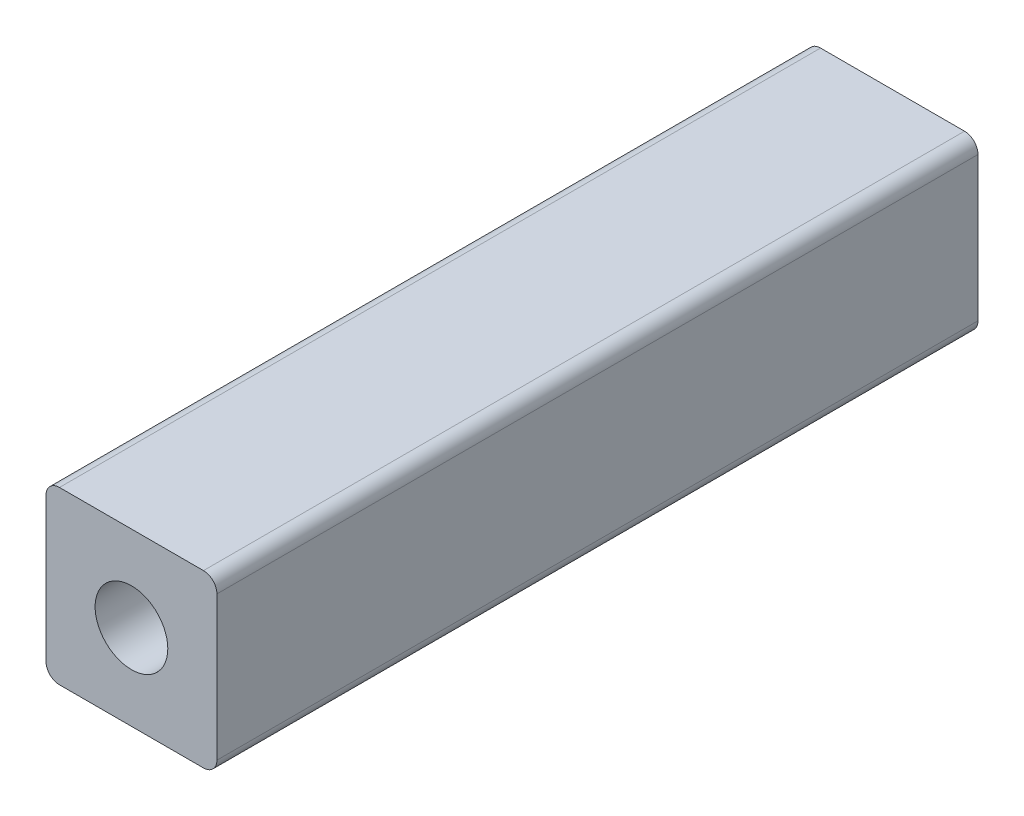
ISO-10303-21;
HEADER;
FILE_DESCRIPTION(('STEP AP214'),'2;1');
FILE_NAME('part.step','',(''),(''),'','','');
FILE_SCHEMA(('AUTOMOTIVE_DESIGN { 1 0 10303 214 1 1 1 1 }'));
ENDSEC;
DATA;
#1=APPLICATION_CONTEXT('core data for automotive mechanical design processes');
#2=APPLICATION_PROTOCOL_DEFINITION('international standard','automotive_design',2000,#1);
#3=PRODUCT_CONTEXT('',#1,'mechanical');
#4=PRODUCT('Part','Part','',(#3));
#5=PRODUCT_RELATED_PRODUCT_CATEGORY('part','',(#4));
#6=PRODUCT_DEFINITION_FORMATION('','',#4);
#7=PRODUCT_DEFINITION_CONTEXT('part definition',#1,'design');
#8=PRODUCT_DEFINITION('design','',#6,#7);
#9=PRODUCT_DEFINITION_SHAPE('','',#8);
#10=(LENGTH_UNIT() NAMED_UNIT(*) SI_UNIT(.MILLI.,.METRE.));
#11=(NAMED_UNIT(*) PLANE_ANGLE_UNIT() SI_UNIT($,.RADIAN.));
#12=(NAMED_UNIT(*) SI_UNIT($,.STERADIAN.) SOLID_ANGLE_UNIT());
#13=UNCERTAINTY_MEASURE_WITH_UNIT(LENGTH_MEASURE(1.E-05),#10,'distance_accuracy_value','');
#14=(GEOMETRIC_REPRESENTATION_CONTEXT(3) GLOBAL_UNCERTAINTY_ASSIGNED_CONTEXT((#13)) GLOBAL_UNIT_ASSIGNED_CONTEXT((#10,
#11,#12)) REPRESENTATION_CONTEXT('',''));
#15=CARTESIAN_POINT('',(0.,0.,0.));
#16=DIRECTION('',(0.,0.,1.));
#17=DIRECTION('',(1.,0.,0.));
#18=AXIS2_PLACEMENT_3D('',#15,#16,#17);
#19=CARTESIAN_POINT('',(0.,0.,28.275));
#20=DIRECTION('',(0.,0.,1.));
#21=DIRECTION('',(1.,0.,0.));
#22=AXIS2_PLACEMENT_3D('',#19,#20,#21);
#23=PLANE('',#22);
#24=DIRECTION('',(0.,-1.,0.));
#25=VECTOR('',#24,1.);
#26=CARTESIAN_POINT('',(-6.35,6.35,28.275));
#27=LINE('',#26,#25);
#28=CARTESIAN_POINT('',(-6.35,5.35,28.275));
#29=VERTEX_POINT('',#28);
#30=CARTESIAN_POINT('',(-6.35,-5.35,28.275));
#31=VERTEX_POINT('',#30);
#32=EDGE_CURVE('E181',#29,#31,#27,.T.);
#33=ORIENTED_EDGE('',*,*,#32,.T.);
#34=CARTESIAN_POINT('',(-5.35,-5.35,28.275));
#35=DIRECTION('',(0.,0.,1.));
#36=DIRECTION('',(1.,0.,0.));
#37=AXIS2_PLACEMENT_3D('',#34,#35,#36);
#38=CIRCLE('',#37,1.);
#39=CARTESIAN_POINT('',(-5.35,-6.35,28.275));
#40=VERTEX_POINT('',#39);
#41=EDGE_CURVE('E158',#31,#40,#38,.T.);
#42=ORIENTED_EDGE('',*,*,#41,.T.);
#43=DIRECTION('',(1.,0.,0.));
#44=VECTOR('',#43,1.);
#45=CARTESIAN_POINT('',(-6.35,-6.35,28.275));
#46=LINE('',#45,#44);
#47=CARTESIAN_POINT('',(5.35,-6.35,28.275));
#48=VERTEX_POINT('',#47);
#49=EDGE_CURVE('E129',#40,#48,#46,.T.);
#50=ORIENTED_EDGE('',*,*,#49,.T.);
#51=CARTESIAN_POINT('',(5.35,-5.35,28.275));
#52=DIRECTION('',(0.,0.,1.));
#53=DIRECTION('',(1.,0.,0.));
#54=AXIS2_PLACEMENT_3D('',#51,#52,#53);
#55=CIRCLE('',#54,1.);
#56=CARTESIAN_POINT('',(6.35,-5.35,28.275));
#57=VERTEX_POINT('',#56);
#58=EDGE_CURVE('E153',#48,#57,#55,.T.);
#59=ORIENTED_EDGE('',*,*,#58,.T.);
#60=DIRECTION('',(0.,1.,0.));
#61=VECTOR('',#60,1.);
#62=CARTESIAN_POINT('',(6.35,6.35,28.275));
#63=LINE('',#62,#61);
#64=CARTESIAN_POINT('',(6.35,5.35,28.275));
#65=VERTEX_POINT('',#64);
#66=EDGE_CURVE('E136',#57,#65,#63,.T.);
#67=ORIENTED_EDGE('',*,*,#66,.T.);
#68=CARTESIAN_POINT('',(5.35,5.35,28.275));
#69=DIRECTION('',(0.,0.,1.));
#70=DIRECTION('',(1.,0.,0.));
#71=AXIS2_PLACEMENT_3D('',#68,#69,#70);
#72=CIRCLE('',#71,1.);
#73=CARTESIAN_POINT('',(5.35,6.35,28.275));
#74=VERTEX_POINT('',#73);
#75=EDGE_CURVE('E65',#65,#74,#72,.T.);
#76=ORIENTED_EDGE('',*,*,#75,.T.);
#77=DIRECTION('',(-1.,0.,0.));
#78=VECTOR('',#77,1.);
#79=CARTESIAN_POINT('',(-6.35,6.35,28.275));
#80=LINE('',#79,#78);
#81=CARTESIAN_POINT('',(-5.35,6.35,28.275));
#82=VERTEX_POINT('',#81);
#83=EDGE_CURVE('E139',#74,#82,#80,.T.);
#84=ORIENTED_EDGE('',*,*,#83,.T.);
#85=CARTESIAN_POINT('',(-5.35,5.35,28.275));
#86=DIRECTION('',(0.,0.,1.));
#87=DIRECTION('',(1.,0.,0.));
#88=AXIS2_PLACEMENT_3D('',#85,#86,#87);
#89=CIRCLE('',#88,1.);
#90=EDGE_CURVE('E156',#82,#29,#89,.T.);
#91=ORIENTED_EDGE('',*,*,#90,.T.);
#92=EDGE_LOOP('',(#33,#42,#50,#59,#67,#76,#84,#91));
#93=FACE_BOUND('',#92,.T.);
#94=CARTESIAN_POINT('',(0.,0.,28.275));
#95=DIRECTION('',(0.,0.,1.));
#96=DIRECTION('',(1.,0.,0.));
#97=AXIS2_PLACEMENT_3D('',#94,#95,#96);
#98=CIRCLE('',#97,2.7);
#99=CARTESIAN_POINT('',(2.7,0.,28.275));
#100=VERTEX_POINT('',#99);
#101=EDGE_CURVE('E174',#100,#100,#98,.T.);
#102=ORIENTED_EDGE('',*,*,#101,.F.);
#103=EDGE_LOOP('',(#102));
#104=FACE_BOUND('',#103,.T.);
#105=ADVANCED_FACE('F43',(#93,#104),#23,.T.);
#106=CARTESIAN_POINT('',(0.,0.,-28.275));
#107=DIRECTION('',(0.,0.,1.));
#108=DIRECTION('',(1.,0.,0.));
#109=AXIS2_PLACEMENT_3D('',#106,#107,#108);
#110=PLANE('',#109);
#111=DIRECTION('',(1.,0.,0.));
#112=VECTOR('',#111,1.);
#113=CARTESIAN_POINT('',(-6.35,-6.35,-28.275));
#114=LINE('',#113,#112);
#115=CARTESIAN_POINT('',(-5.35,-6.35,-28.275));
#116=VERTEX_POINT('',#115);
#117=CARTESIAN_POINT('',(5.35,-6.35,-28.275));
#118=VERTEX_POINT('',#117);
#119=EDGE_CURVE('E126',#116,#118,#114,.T.);
#120=ORIENTED_EDGE('',*,*,#119,.F.);
#121=CARTESIAN_POINT('',(-5.35,-5.35,-28.275));
#122=DIRECTION('',(0.,0.,1.));
#123=DIRECTION('',(1.,0.,0.));
#124=AXIS2_PLACEMENT_3D('',#121,#122,#123);
#125=CIRCLE('',#124,1.);
#126=CARTESIAN_POINT('',(-6.35,-5.35,-28.275));
#127=VERTEX_POINT('',#126);
#128=EDGE_CURVE('E109',#116,#127,#125,.F.);
#129=ORIENTED_EDGE('',*,*,#128,.T.);
#130=DIRECTION('',(0.,-1.,0.));
#131=VECTOR('',#130,1.);
#132=CARTESIAN_POINT('',(-6.35,6.35,-28.275));
#133=LINE('',#132,#131);
#134=CARTESIAN_POINT('',(-6.35,5.35,-28.275));
#135=VERTEX_POINT('',#134);
#136=EDGE_CURVE('E137',#135,#127,#133,.T.);
#137=ORIENTED_EDGE('',*,*,#136,.F.);
#138=CARTESIAN_POINT('',(-5.35,5.35,-28.275));
#139=DIRECTION('',(0.,0.,1.));
#140=DIRECTION('',(1.,0.,0.));
#141=AXIS2_PLACEMENT_3D('',#138,#139,#140);
#142=CIRCLE('',#141,1.);
#143=CARTESIAN_POINT('',(-5.35,6.35,-28.275));
#144=VERTEX_POINT('',#143);
#145=EDGE_CURVE('E120',#135,#144,#142,.F.);
#146=ORIENTED_EDGE('',*,*,#145,.T.);
#147=DIRECTION('',(-1.,0.,0.));
#148=VECTOR('',#147,1.);
#149=CARTESIAN_POINT('',(-6.35,6.35,-28.275));
#150=LINE('',#149,#148);
#151=CARTESIAN_POINT('',(5.35,6.35,-28.275));
#152=VERTEX_POINT('',#151);
#153=EDGE_CURVE('E141',#152,#144,#150,.T.);
#154=ORIENTED_EDGE('',*,*,#153,.F.);
#155=CARTESIAN_POINT('',(5.35,5.35,-28.275));
#156=DIRECTION('',(0.,0.,1.));
#157=DIRECTION('',(1.,0.,0.));
#158=AXIS2_PLACEMENT_3D('',#155,#156,#157);
#159=CIRCLE('',#158,1.);
#160=CARTESIAN_POINT('',(6.35,5.35,-28.275));
#161=VERTEX_POINT('',#160);
#162=EDGE_CURVE('E147',#152,#161,#159,.F.);
#163=ORIENTED_EDGE('',*,*,#162,.T.);
#164=DIRECTION('',(0.,1.,0.));
#165=VECTOR('',#164,1.);
#166=CARTESIAN_POINT('',(6.35,6.35,-28.275));
#167=LINE('',#166,#165);
#168=CARTESIAN_POINT('',(6.35,-5.35,-28.275));
#169=VERTEX_POINT('',#168);
#170=EDGE_CURVE('E169',#169,#161,#167,.T.);
#171=ORIENTED_EDGE('',*,*,#170,.F.);
#172=CARTESIAN_POINT('',(5.35,-5.35,-28.275));
#173=DIRECTION('',(0.,0.,1.));
#174=DIRECTION('',(1.,0.,0.));
#175=AXIS2_PLACEMENT_3D('',#172,#173,#174);
#176=CIRCLE('',#175,1.);
#177=EDGE_CURVE('E130',#169,#118,#176,.F.);
#178=ORIENTED_EDGE('',*,*,#177,.T.);
#179=EDGE_LOOP('',(#120,#129,#137,#146,#154,#163,#171,#178));
#180=FACE_BOUND('',#179,.T.);
#181=CARTESIAN_POINT('',(0.,0.,-28.275));
#182=DIRECTION('',(0.,0.,1.));
#183=DIRECTION('',(1.,0.,0.));
#184=AXIS2_PLACEMENT_3D('',#181,#182,#183);
#185=CIRCLE('',#184,2.7);
#186=CARTESIAN_POINT('',(2.7,0.,-28.275));
#187=VERTEX_POINT('',#186);
#188=EDGE_CURVE('E177',#187,#187,#185,.T.);
#189=ORIENTED_EDGE('',*,*,#188,.T.);
#190=EDGE_LOOP('',(#189));
#191=FACE_BOUND('',#190,.T.);
#192=ADVANCED_FACE('F133',(#180,#191),#110,.F.);
#193=CARTESIAN_POINT('',(6.35,6.35,28.275));
#194=DIRECTION('',(-1.,0.,0.));
#195=DIRECTION('',(0.,-1.,0.));
#196=AXIS2_PLACEMENT_3D('',#193,#194,#195);
#197=PLANE('',#196);
#198=ORIENTED_EDGE('',*,*,#170,.T.);
#199=DIRECTION('',(0.,0.,-1.));
#200=VECTOR('',#199,1.);
#201=CARTESIAN_POINT('',(6.35,5.35,28.275));
#202=LINE('',#201,#200);
#203=EDGE_CURVE('E11',#161,#65,#202,.F.);
#204=ORIENTED_EDGE('',*,*,#203,.T.);
#205=ORIENTED_EDGE('',*,*,#66,.F.);
#206=DIRECTION('',(0.,0.,-1.));
#207=VECTOR('',#206,1.);
#208=CARTESIAN_POINT('',(6.35,-5.35,28.275));
#209=LINE('',#208,#207);
#210=EDGE_CURVE('E51',#57,#169,#209,.T.);
#211=ORIENTED_EDGE('',*,*,#210,.T.);
#212=EDGE_LOOP('',(#198,#204,#205,#211));
#213=FACE_BOUND('',#212,.T.);
#214=ADVANCED_FACE('F168',(#213),#197,.F.);
#215=CARTESIAN_POINT('',(-6.35,6.35,28.275));
#216=DIRECTION('',(0.,-1.,0.));
#217=DIRECTION('',(0.,0.,-1.));
#218=AXIS2_PLACEMENT_3D('',#215,#216,#217);
#219=PLANE('',#218);
#220=ORIENTED_EDGE('',*,*,#153,.T.);
#221=DIRECTION('',(0.,0.,-1.));
#222=VECTOR('',#221,1.);
#223=CARTESIAN_POINT('',(-5.35,6.35,28.275));
#224=LINE('',#223,#222);
#225=EDGE_CURVE('E58',#144,#82,#224,.F.);
#226=ORIENTED_EDGE('',*,*,#225,.T.);
#227=ORIENTED_EDGE('',*,*,#83,.F.);
#228=DIRECTION('',(0.,0.,-1.));
#229=VECTOR('',#228,1.);
#230=CARTESIAN_POINT('',(5.35,6.35,28.275));
#231=LINE('',#230,#229);
#232=EDGE_CURVE('E160',#74,#152,#231,.T.);
#233=ORIENTED_EDGE('',*,*,#232,.T.);
#234=EDGE_LOOP('',(#220,#226,#227,#233));
#235=FACE_BOUND('',#234,.T.);
#236=ADVANCED_FACE('F210',(#235),#219,.F.);
#237=CARTESIAN_POINT('',(-6.35,6.35,28.275));
#238=DIRECTION('',(1.,0.,0.));
#239=DIRECTION('',(0.,1.,0.));
#240=AXIS2_PLACEMENT_3D('',#237,#238,#239);
#241=PLANE('',#240);
#242=ORIENTED_EDGE('',*,*,#136,.T.);
#243=DIRECTION('',(0.,0.,-1.));
#244=VECTOR('',#243,1.);
#245=CARTESIAN_POINT('',(-6.35,-5.35,28.275));
#246=LINE('',#245,#244);
#247=EDGE_CURVE('E114',#127,#31,#246,.F.);
#248=ORIENTED_EDGE('',*,*,#247,.T.);
#249=ORIENTED_EDGE('',*,*,#32,.F.);
#250=DIRECTION('',(0.,0.,-1.));
#251=VECTOR('',#250,1.);
#252=CARTESIAN_POINT('',(-6.35,5.35,28.275));
#253=LINE('',#252,#251);
#254=EDGE_CURVE('E119',#29,#135,#253,.T.);
#255=ORIENTED_EDGE('',*,*,#254,.T.);
#256=EDGE_LOOP('',(#242,#248,#249,#255));
#257=FACE_BOUND('',#256,.T.);
#258=ADVANCED_FACE('F199',(#257),#241,.F.);
#259=CARTESIAN_POINT('',(-6.35,-6.35,28.275));
#260=DIRECTION('',(0.,1.,0.));
#261=DIRECTION('',(0.,0.,1.));
#262=AXIS2_PLACEMENT_3D('',#259,#260,#261);
#263=PLANE('',#262);
#264=ORIENTED_EDGE('',*,*,#49,.F.);
#265=DIRECTION('',(0.,0.,-1.));
#266=VECTOR('',#265,1.);
#267=CARTESIAN_POINT('',(-5.35,-6.35,28.275));
#268=LINE('',#267,#266);
#269=EDGE_CURVE('E113',#40,#116,#268,.T.);
#270=ORIENTED_EDGE('',*,*,#269,.T.);
#271=ORIENTED_EDGE('',*,*,#119,.T.);
#272=DIRECTION('',(0.,0.,-1.));
#273=VECTOR('',#272,1.);
#274=CARTESIAN_POINT('',(5.35,-6.35,28.275));
#275=LINE('',#274,#273);
#276=EDGE_CURVE('E131',#118,#48,#275,.F.);
#277=ORIENTED_EDGE('',*,*,#276,.T.);
#278=EDGE_LOOP('',(#264,#270,#271,#277));
#279=FACE_BOUND('',#278,.T.);
#280=ADVANCED_FACE('F125',(#279),#263,.F.);
#281=CARTESIAN_POINT('',(0.,0.,28.275));
#282=DIRECTION('',(0.,0.,-1.));
#283=DIRECTION('',(-1.,0.,0.));
#284=AXIS2_PLACEMENT_3D('',#281,#282,#283);
#285=CYLINDRICAL_SURFACE('',#284,2.7);
#286=ORIENTED_EDGE('',*,*,#101,.T.);
#287=EDGE_LOOP('',(#286));
#288=FACE_BOUND('',#287,.T.);
#289=ORIENTED_EDGE('',*,*,#188,.F.);
#290=EDGE_LOOP('',(#289));
#291=FACE_BOUND('',#290,.T.);
#292=ADVANCED_FACE('F188',(#288,#291),#285,.F.);
#293=CARTESIAN_POINT('',(-5.35,-5.35,28.275));
#294=DIRECTION('',(0.,0.,-1.));
#295=DIRECTION('',(-1.,0.,0.));
#296=AXIS2_PLACEMENT_3D('',#293,#294,#295);
#297=CYLINDRICAL_SURFACE('',#296,1.);
#298=ORIENTED_EDGE('',*,*,#41,.F.);
#299=ORIENTED_EDGE('',*,*,#247,.F.);
#300=ORIENTED_EDGE('',*,*,#128,.F.);
#301=ORIENTED_EDGE('',*,*,#269,.F.);
#302=EDGE_LOOP('',(#298,#299,#300,#301));
#303=FACE_BOUND('',#302,.T.);
#304=ADVANCED_FACE('F112',(#303),#297,.T.);
#305=CARTESIAN_POINT('',(-5.35,5.35,28.275));
#306=DIRECTION('',(0.,0.,-1.));
#307=DIRECTION('',(-1.,0.,0.));
#308=AXIS2_PLACEMENT_3D('',#305,#306,#307);
#309=CYLINDRICAL_SURFACE('',#308,1.);
#310=ORIENTED_EDGE('',*,*,#90,.F.);
#311=ORIENTED_EDGE('',*,*,#225,.F.);
#312=ORIENTED_EDGE('',*,*,#145,.F.);
#313=ORIENTED_EDGE('',*,*,#254,.F.);
#314=EDGE_LOOP('',(#310,#311,#312,#313));
#315=FACE_BOUND('',#314,.T.);
#316=ADVANCED_FACE('F196',(#315),#309,.T.);
#317=CARTESIAN_POINT('',(5.35,5.35,28.275));
#318=DIRECTION('',(0.,0.,-1.));
#319=DIRECTION('',(-1.,0.,0.));
#320=AXIS2_PLACEMENT_3D('',#317,#318,#319);
#321=CYLINDRICAL_SURFACE('',#320,1.);
#322=ORIENTED_EDGE('',*,*,#75,.F.);
#323=ORIENTED_EDGE('',*,*,#203,.F.);
#324=ORIENTED_EDGE('',*,*,#162,.F.);
#325=ORIENTED_EDGE('',*,*,#232,.F.);
#326=EDGE_LOOP('',(#322,#323,#324,#325));
#327=FACE_BOUND('',#326,.T.);
#328=ADVANCED_FACE('F217',(#327),#321,.T.);
#329=CARTESIAN_POINT('',(5.35,-5.35,28.275));
#330=DIRECTION('',(0.,0.,-1.));
#331=DIRECTION('',(-1.,0.,0.));
#332=AXIS2_PLACEMENT_3D('',#329,#330,#331);
#333=CYLINDRICAL_SURFACE('',#332,1.);
#334=ORIENTED_EDGE('',*,*,#58,.F.);
#335=ORIENTED_EDGE('',*,*,#276,.F.);
#336=ORIENTED_EDGE('',*,*,#177,.F.);
#337=ORIENTED_EDGE('',*,*,#210,.F.);
#338=EDGE_LOOP('',(#334,#335,#336,#337));
#339=FACE_BOUND('',#338,.T.);
#340=ADVANCED_FACE('F45',(#339),#333,.T.);
#341=CLOSED_SHELL('',(#105,#192,#214,#236,#258,#280,#292,#304,#316,#328,#340));
#342=MANIFOLD_SOLID_BREP('B2',#341);
#343=ADVANCED_BREP_SHAPE_REPRESENTATION('',(#18,#342),#14);
#344=SHAPE_DEFINITION_REPRESENTATION(#9,#343);
ENDSEC;
END-ISO-10303-21;
